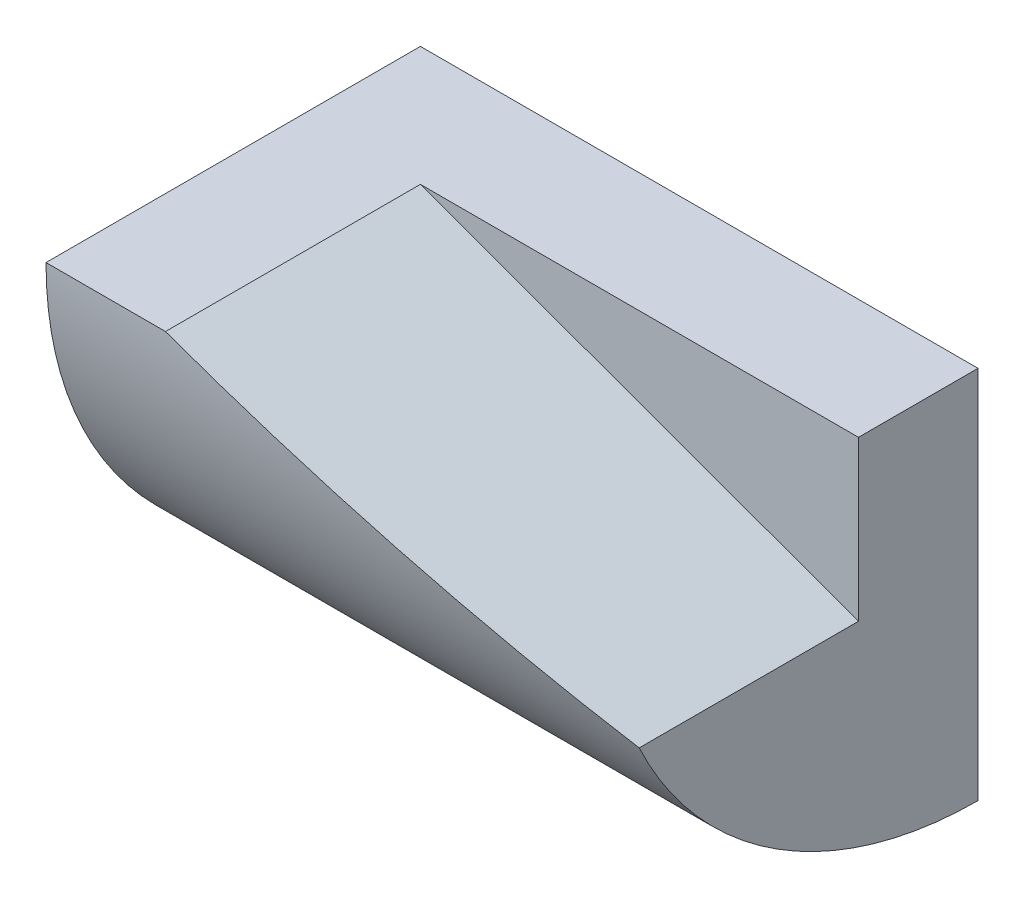
ISO-10303-21;
HEADER;
FILE_DESCRIPTION(('STEP AP214'),'2;1');
FILE_NAME('part.step','',(''),(''),'','','');
FILE_SCHEMA(('AUTOMOTIVE_DESIGN { 1 0 10303 214 1 1 1 1 }'));
ENDSEC;
DATA;
#1=APPLICATION_CONTEXT('core data for automotive mechanical design processes');
#2=APPLICATION_PROTOCOL_DEFINITION('international standard','automotive_design',2000,#1);
#3=PRODUCT_CONTEXT('',#1,'mechanical');
#4=PRODUCT('Part','Part','',(#3));
#5=PRODUCT_RELATED_PRODUCT_CATEGORY('part','',(#4));
#6=PRODUCT_DEFINITION_FORMATION('','',#4);
#7=PRODUCT_DEFINITION_CONTEXT('part definition',#1,'design');
#8=PRODUCT_DEFINITION('design','',#6,#7);
#9=PRODUCT_DEFINITION_SHAPE('','',#8);
#10=(LENGTH_UNIT() NAMED_UNIT(*) SI_UNIT(.MILLI.,.METRE.));
#11=(NAMED_UNIT(*) PLANE_ANGLE_UNIT() SI_UNIT($,.RADIAN.));
#12=(NAMED_UNIT(*) SI_UNIT($,.STERADIAN.) SOLID_ANGLE_UNIT());
#13=UNCERTAINTY_MEASURE_WITH_UNIT(LENGTH_MEASURE(1.E-05),#10,'distance_accuracy_value','');
#14=(GEOMETRIC_REPRESENTATION_CONTEXT(3) GLOBAL_UNCERTAINTY_ASSIGNED_CONTEXT((#13)) GLOBAL_UNIT_ASSIGNED_CONTEXT((#10,
#11,#12)) REPRESENTATION_CONTEXT('',''));
#15=CARTESIAN_POINT('',(0.,0.,0.));
#16=DIRECTION('',(0.,0.,1.));
#17=DIRECTION('',(1.,0.,0.));
#18=AXIS2_PLACEMENT_3D('',#15,#16,#17);
#19=CARTESIAN_POINT('',(70.,0.,0.));
#20=DIRECTION('',(0.,0.,1.));
#21=DIRECTION('',(0.,-1.,0.));
#22=AXIS2_PLACEMENT_3D('',#19,#20,#21);
#23=PLANE('',#22);
#24=DIRECTION('',(0.,1.,0.));
#25=VECTOR('',#24,1.);
#26=CARTESIAN_POINT('',(0.,0.,0.));
#27=LINE('',#26,#25);
#28=CARTESIAN_POINT('',(0.,-47.,0.));
#29=VERTEX_POINT('',#28);
#30=CARTESIAN_POINT('',(0.,0.,0.));
#31=VERTEX_POINT('',#30);
#32=EDGE_CURVE('E88',#29,#31,#27,.T.);
#33=ORIENTED_EDGE('',*,*,#32,.T.);
#34=DIRECTION('',(-1.,0.,0.));
#35=VECTOR('',#34,1.);
#36=CARTESIAN_POINT('',(70.,0.,0.));
#37=LINE('',#36,#35);
#38=CARTESIAN_POINT('',(70.,0.,0.));
#39=VERTEX_POINT('',#38);
#40=EDGE_CURVE('E11',#39,#31,#37,.T.);
#41=ORIENTED_EDGE('',*,*,#40,.F.);
#42=DIRECTION('',(0.,1.,0.));
#43=VECTOR('',#42,1.);
#44=CARTESIAN_POINT('',(70.,0.,0.));
#45=LINE('',#44,#43);
#46=CARTESIAN_POINT('',(70.,-47.,0.));
#47=VERTEX_POINT('',#46);
#48=EDGE_CURVE('E82',#47,#39,#45,.T.);
#49=ORIENTED_EDGE('',*,*,#48,.F.);
#50=DIRECTION('',(-1.,0.,0.));
#51=VECTOR('',#50,1.);
#52=CARTESIAN_POINT('',(70.,-47.,0.));
#53=LINE('',#52,#51);
#54=EDGE_CURVE('E75',#47,#29,#53,.T.);
#55=ORIENTED_EDGE('',*,*,#54,.T.);
#56=EDGE_LOOP('',(#33,#41,#49,#55));
#57=FACE_BOUND('',#56,.T.);
#58=ADVANCED_FACE('F33',(#57),#23,.F.);
#59=CARTESIAN_POINT('',(70.,0.,47.));
#60=DIRECTION('',(0.,-1.,0.));
#61=DIRECTION('',(0.,0.,-1.));
#62=AXIS2_PLACEMENT_3D('',#59,#60,#61);
#63=PLANE('',#62);
#64=DIRECTION('',(-1.,0.,0.));
#65=VECTOR('',#64,1.);
#66=CARTESIAN_POINT('',(70.,0.,47.));
#67=LINE('',#66,#65);
#68=CARTESIAN_POINT('',(15.,0.,47.));
#69=VERTEX_POINT('',#68);
#70=CARTESIAN_POINT('',(0.,0.,47.));
#71=VERTEX_POINT('',#70);
#72=EDGE_CURVE('E40',#69,#71,#67,.T.);
#73=ORIENTED_EDGE('',*,*,#72,.F.);
#74=DIRECTION('',(0.,0.,1.));
#75=VECTOR('',#74,1.);
#76=CARTESIAN_POINT('',(15.,0.,15.));
#77=LINE('',#76,#75);
#78=CARTESIAN_POINT('',(15.,0.,15.));
#79=VERTEX_POINT('',#78);
#80=EDGE_CURVE('E102',#79,#69,#77,.T.);
#81=ORIENTED_EDGE('',*,*,#80,.F.);
#82=DIRECTION('',(-1.,0.,0.));
#83=VECTOR('',#82,1.);
#84=CARTESIAN_POINT('',(70.,0.,15.));
#85=LINE('',#84,#83);
#86=CARTESIAN_POINT('',(70.,0.,15.));
#87=VERTEX_POINT('',#86);
#88=EDGE_CURVE('E107',#87,#79,#85,.T.);
#89=ORIENTED_EDGE('',*,*,#88,.F.);
#90=DIRECTION('',(0.,0.,1.));
#91=VECTOR('',#90,1.);
#92=CARTESIAN_POINT('',(70.,0.,47.));
#93=LINE('',#92,#91);
#94=EDGE_CURVE('E98',#39,#87,#93,.T.);
#95=ORIENTED_EDGE('',*,*,#94,.F.);
#96=ORIENTED_EDGE('',*,*,#40,.T.);
#97=DIRECTION('',(0.,0.,1.));
#98=VECTOR('',#97,1.);
#99=CARTESIAN_POINT('',(0.,0.,47.));
#100=LINE('',#99,#98);
#101=EDGE_CURVE('E83',#31,#71,#100,.T.);
#102=ORIENTED_EDGE('',*,*,#101,.T.);
#103=EDGE_LOOP('',(#73,#81,#89,#95,#96,#102));
#104=FACE_BOUND('',#103,.T.);
#105=ADVANCED_FACE('F119',(#104),#63,.F.);
#106=CARTESIAN_POINT('',(70.,0.,0.));
#107=DIRECTION('',(-1.,0.,0.));
#108=DIRECTION('',(0.,0.,1.));
#109=AXIS2_PLACEMENT_3D('',#106,#107,#108);
#110=CYLINDRICAL_SURFACE('',#109,47.);
#111=CARTESIAN_POINT('',(70.,0.,0.));
#112=DIRECTION('',(1.,0.,0.));
#113=DIRECTION('',(0.,0.,1.));
#114=AXIS2_PLACEMENT_3D('',#111,#112,#113);
#115=CIRCLE('',#114,47.);
#116=CARTESIAN_POINT('',(70.,-20.,42.5323406362735));
#117=VERTEX_POINT('',#116);
#118=EDGE_CURVE('E56',#117,#47,#115,.T.);
#119=ORIENTED_EDGE('',*,*,#118,.F.);
#120=CARTESIAN_POINT('',(15.,0.,0.));
#121=DIRECTION('',(-0.341743063086704,-0.939793423488437,0.));
#122=DIRECTION('',(-0.939793423488437,0.341743063086704,0.));
#123=AXIS2_PLACEMENT_3D('',#120,#121,#122);
#124=ELLIPSE('',#123,137.530223950956,47.);
#125=EDGE_CURVE('E91',#117,#69,#124,.T.);
#126=ORIENTED_EDGE('',*,*,#125,.T.);
#127=ORIENTED_EDGE('',*,*,#72,.T.);
#128=CARTESIAN_POINT('',(0.,0.,0.));
#129=DIRECTION('',(1.,0.,0.));
#130=DIRECTION('',(0.,0.,1.));
#131=AXIS2_PLACEMENT_3D('',#128,#129,#130);
#132=CIRCLE('',#131,47.);
#133=EDGE_CURVE('E72',#71,#29,#132,.T.);
#134=ORIENTED_EDGE('',*,*,#133,.T.);
#135=ORIENTED_EDGE('',*,*,#54,.F.);
#136=EDGE_LOOP('',(#119,#126,#127,#134,#135));
#137=FACE_BOUND('',#136,.T.);
#138=ADVANCED_FACE('F74',(#137),#110,.T.);
#139=CARTESIAN_POINT('',(70.,0.,0.));
#140=DIRECTION('',(-1.,0.,0.));
#141=DIRECTION('',(0.,0.,1.));
#142=AXIS2_PLACEMENT_3D('',#139,#140,#141);
#143=PLANE('',#142);
#144=DIRECTION('',(0.,1.,0.));
#145=VECTOR('',#144,1.);
#146=CARTESIAN_POINT('',(70.,-20.,15.));
#147=LINE('',#146,#145);
#148=CARTESIAN_POINT('',(70.,-20.,15.));
#149=VERTEX_POINT('',#148);
#150=EDGE_CURVE('E109',#149,#87,#147,.T.);
#151=ORIENTED_EDGE('',*,*,#150,.F.);
#152=DIRECTION('',(0.,0.,1.));
#153=VECTOR('',#152,1.);
#154=CARTESIAN_POINT('',(70.,-20.,15.));
#155=LINE('',#154,#153);
#156=EDGE_CURVE('E94',#149,#117,#155,.T.);
#157=ORIENTED_EDGE('',*,*,#156,.T.);
#158=ORIENTED_EDGE('',*,*,#118,.T.);
#159=ORIENTED_EDGE('',*,*,#48,.T.);
#160=ORIENTED_EDGE('',*,*,#94,.T.);
#161=EDGE_LOOP('',(#151,#157,#158,#159,#160));
#162=FACE_BOUND('',#161,.T.);
#163=ADVANCED_FACE('F120',(#162),#143,.F.);
#164=CARTESIAN_POINT('',(0.,0.,0.));
#165=DIRECTION('',(-1.,0.,0.));
#166=DIRECTION('',(0.,0.,1.));
#167=AXIS2_PLACEMENT_3D('',#164,#165,#166);
#168=PLANE('',#167);
#169=ORIENTED_EDGE('',*,*,#32,.F.);
#170=ORIENTED_EDGE('',*,*,#133,.F.);
#171=ORIENTED_EDGE('',*,*,#101,.F.);
#172=EDGE_LOOP('',(#169,#170,#171));
#173=FACE_BOUND('',#172,.T.);
#174=ADVANCED_FACE('F90',(#173),#168,.T.);
#175=CARTESIAN_POINT('',(15.,0.,15.));
#176=DIRECTION('',(-0.341743063086704,-0.939793423488437,0.));
#177=DIRECTION('',(0.939793423488437,-0.341743063086704,0.));
#178=AXIS2_PLACEMENT_3D('',#175,#176,#177);
#179=PLANE('',#178);
#180=ORIENTED_EDGE('',*,*,#156,.F.);
#181=DIRECTION('',(0.939793423488437,-0.341743063086704,0.));
#182=VECTOR('',#181,1.);
#183=CARTESIAN_POINT('',(15.,0.,15.));
#184=LINE('',#183,#182);
#185=EDGE_CURVE('E47',#79,#149,#184,.T.);
#186=ORIENTED_EDGE('',*,*,#185,.F.);
#187=ORIENTED_EDGE('',*,*,#80,.T.);
#188=ORIENTED_EDGE('',*,*,#125,.F.);
#189=EDGE_LOOP('',(#180,#186,#187,#188));
#190=FACE_BOUND('',#189,.T.);
#191=ADVANCED_FACE('F125',(#190),#179,.F.);
#192=CARTESIAN_POINT('',(0.,0.,15.));
#193=DIRECTION('',(0.,0.,1.));
#194=DIRECTION('',(0.,-1.,0.));
#195=AXIS2_PLACEMENT_3D('',#192,#193,#194);
#196=PLANE('',#195);
#197=ORIENTED_EDGE('',*,*,#150,.T.);
#198=ORIENTED_EDGE('',*,*,#88,.T.);
#199=ORIENTED_EDGE('',*,*,#185,.T.);
#200=EDGE_LOOP('',(#197,#198,#199));
#201=FACE_BOUND('',#200,.T.);
#202=ADVANCED_FACE('F113',(#201),#196,.T.);
#203=CLOSED_SHELL('',(#58,#105,#138,#163,#174,#191,#202));
#204=MANIFOLD_SOLID_BREP('B2',#203);
#205=ADVANCED_BREP_SHAPE_REPRESENTATION('',(#18,#204),#14);
#206=SHAPE_DEFINITION_REPRESENTATION(#9,#205);
ENDSEC;
END-ISO-10303-21;
